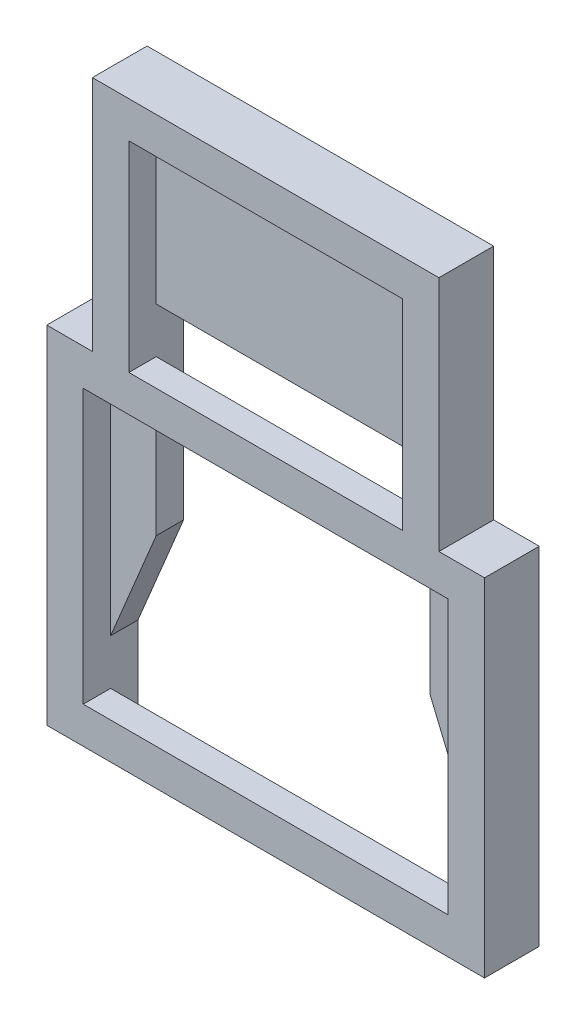
ISO-10303-21;
HEADER;
FILE_DESCRIPTION(('STEP AP214'),'2;1');
FILE_NAME('part.step','',(''),(''),'','','');
FILE_SCHEMA(('AUTOMOTIVE_DESIGN { 1 0 10303 214 1 1 1 1 }'));
ENDSEC;
DATA;
#1=APPLICATION_CONTEXT('core data for automotive mechanical design processes');
#2=APPLICATION_PROTOCOL_DEFINITION('international standard','automotive_design',2000,#1);
#3=PRODUCT_CONTEXT('',#1,'mechanical');
#4=PRODUCT('Part','Part','',(#3));
#5=PRODUCT_RELATED_PRODUCT_CATEGORY('part','',(#4));
#6=PRODUCT_DEFINITION_FORMATION('','',#4);
#7=PRODUCT_DEFINITION_CONTEXT('part definition',#1,'design');
#8=PRODUCT_DEFINITION('design','',#6,#7);
#9=PRODUCT_DEFINITION_SHAPE('','',#8);
#10=(LENGTH_UNIT() NAMED_UNIT(*) SI_UNIT(.MILLI.,.METRE.));
#11=(NAMED_UNIT(*) PLANE_ANGLE_UNIT() SI_UNIT($,.RADIAN.));
#12=(NAMED_UNIT(*) SI_UNIT($,.STERADIAN.) SOLID_ANGLE_UNIT());
#13=UNCERTAINTY_MEASURE_WITH_UNIT(LENGTH_MEASURE(1.E-05),#10,'distance_accuracy_value','');
#14=(GEOMETRIC_REPRESENTATION_CONTEXT(3) GLOBAL_UNCERTAINTY_ASSIGNED_CONTEXT((#13)) GLOBAL_UNIT_ASSIGNED_CONTEXT((#10,
#11,#12)) REPRESENTATION_CONTEXT('',''));
#15=CARTESIAN_POINT('',(0.,0.,0.));
#16=DIRECTION('',(0.,0.,1.));
#17=DIRECTION('',(1.,0.,0.));
#18=AXIS2_PLACEMENT_3D('',#15,#16,#17);
#19=CARTESIAN_POINT('',(0.,0.,0.));
#20=DIRECTION('',(0.,0.,1.));
#21=DIRECTION('',(1.,0.,0.));
#22=AXIS2_PLACEMENT_3D('',#19,#20,#21);
#23=PLANE('',#22);
#24=DIRECTION('',(0.,-1.,0.));
#25=VECTOR('',#24,1.);
#26=CARTESIAN_POINT('',(-10.,0.,0.));
#27=LINE('',#26,#25);
#28=CARTESIAN_POINT('',(-10.,0.,0.));
#29=VERTEX_POINT('',#28);
#30=CARTESIAN_POINT('',(-10.,-2.,0.));
#31=VERTEX_POINT('',#30);
#32=EDGE_CURVE('E11',#29,#31,#27,.T.);
#33=ORIENTED_EDGE('',*,*,#32,.F.);
#34=DIRECTION('',(1.,0.,0.));
#35=VECTOR('',#34,1.);
#36=CARTESIAN_POINT('',(0.,0.,0.));
#37=LINE('',#36,#35);
#38=CARTESIAN_POINT('',(10.,0.,0.));
#39=VERTEX_POINT('',#38);
#40=EDGE_CURVE('E399',#29,#39,#37,.T.);
#41=ORIENTED_EDGE('',*,*,#40,.T.);
#42=DIRECTION('',(0.,1.,0.));
#43=VECTOR('',#42,1.);
#44=CARTESIAN_POINT('',(10.,0.,0.));
#45=LINE('',#44,#43);
#46=CARTESIAN_POINT('',(10.,-2.,0.));
#47=VERTEX_POINT('',#46);
#48=EDGE_CURVE('E238',#47,#39,#45,.T.);
#49=ORIENTED_EDGE('',*,*,#48,.F.);
#50=DIRECTION('',(1.,0.,0.));
#51=VECTOR('',#50,1.);
#52=CARTESIAN_POINT('',(0.,-2.,0.));
#53=LINE('',#52,#51);
#54=EDGE_CURVE('E411',#31,#47,#53,.T.);
#55=ORIENTED_EDGE('',*,*,#54,.F.);
#56=EDGE_LOOP('',(#33,#41,#49,#55));
#57=FACE_BOUND('',#56,.T.);
#58=ADVANCED_FACE('F41',(#57),#23,.F.);
#59=DIRECTION('',(0.,-1.,0.));
#60=VECTOR('',#59,1.);
#61=CARTESIAN_POINT('',(-7.5,0.,0.));
#62=LINE('',#61,#60);
#63=CARTESIAN_POINT('',(-7.5,17.,0.));
#64=VERTEX_POINT('',#63);
#65=CARTESIAN_POINT('',(-7.5,15.,0.));
#66=VERTEX_POINT('',#65);
#67=EDGE_CURVE('E51',#64,#66,#62,.T.);
#68=ORIENTED_EDGE('',*,*,#67,.F.);
#69=DIRECTION('',(-1.,0.,0.));
#70=VECTOR('',#69,1.);
#71=CARTESIAN_POINT('',(0.,17.,0.));
#72=LINE('',#71,#70);
#73=CARTESIAN_POINT('',(7.5,17.,0.));
#74=VERTEX_POINT('',#73);
#75=EDGE_CURVE('E416',#74,#64,#72,.T.);
#76=ORIENTED_EDGE('',*,*,#75,.F.);
#77=DIRECTION('',(0.,-1.,0.));
#78=VECTOR('',#77,1.);
#79=CARTESIAN_POINT('',(7.5,0.,0.));
#80=LINE('',#79,#78);
#81=CARTESIAN_POINT('',(7.5,15.,0.));
#82=VERTEX_POINT('',#81);
#83=EDGE_CURVE('E308',#74,#82,#80,.T.);
#84=ORIENTED_EDGE('',*,*,#83,.T.);
#85=DIRECTION('',(-1.,0.,0.));
#86=VECTOR('',#85,1.);
#87=CARTESIAN_POINT('',(0.,15.,0.));
#88=LINE('',#87,#86);
#89=EDGE_CURVE('E412',#82,#66,#88,.T.);
#90=ORIENTED_EDGE('',*,*,#89,.T.);
#91=EDGE_LOOP('',(#68,#76,#84,#90));
#92=FACE_BOUND('',#91,.T.);
#93=ADVANCED_FACE('F534',(#92),#23,.F.);
#94=CARTESIAN_POINT('',(0.,17.,1.5));
#95=DIRECTION('',(0.,-1.,0.));
#96=DIRECTION('',(1.,0.,0.));
#97=AXIS2_PLACEMENT_3D('',#94,#95,#96);
#98=PLANE('',#97);
#99=ORIENTED_EDGE('',*,*,#75,.T.);
#100=DIRECTION('',(0.,0.,-1.));
#101=VECTOR('',#100,1.);
#102=CARTESIAN_POINT('',(-7.5,17.,1.5));
#103=LINE('',#102,#101);
#104=CARTESIAN_POINT('',(-7.5,17.,1.5));
#105=VERTEX_POINT('',#104);
#106=EDGE_CURVE('E437',#105,#64,#103,.T.);
#107=ORIENTED_EDGE('',*,*,#106,.F.);
#108=DIRECTION('',(-1.,0.,0.));
#109=VECTOR('',#108,1.);
#110=CARTESIAN_POINT('',(0.,17.,1.5));
#111=LINE('',#110,#109);
#112=CARTESIAN_POINT('',(7.5,17.,1.5));
#113=VERTEX_POINT('',#112);
#114=EDGE_CURVE('E382',#113,#105,#111,.T.);
#115=ORIENTED_EDGE('',*,*,#114,.F.);
#116=DIRECTION('',(0.,0.,-1.));
#117=VECTOR('',#116,1.);
#118=CARTESIAN_POINT('',(7.5,17.,1.5));
#119=LINE('',#118,#117);
#120=EDGE_CURVE('E427',#113,#74,#119,.T.);
#121=ORIENTED_EDGE('',*,*,#120,.T.);
#122=EDGE_LOOP('',(#99,#107,#115,#121));
#123=FACE_BOUND('',#122,.T.);
#124=ADVANCED_FACE('F539',(#123),#98,.F.);
#125=CARTESIAN_POINT('',(-7.5,0.,1.5));
#126=DIRECTION('',(1.,0.,0.));
#127=DIRECTION('',(0.,1.,0.));
#128=AXIS2_PLACEMENT_3D('',#125,#126,#127);
#129=PLANE('',#128);
#130=DIRECTION('',(0.,-1.,0.));
#131=VECTOR('',#130,1.);
#132=CARTESIAN_POINT('',(-7.5,0.,0.));
#133=LINE('',#132,#131);
#134=CARTESIAN_POINT('',(-7.5,28.,0.));
#135=VERTEX_POINT('',#134);
#136=CARTESIAN_POINT('',(-7.5,19.5,0.));
#137=VERTEX_POINT('',#136);
#138=EDGE_CURVE('E59',#135,#137,#133,.T.);
#139=ORIENTED_EDGE('',*,*,#138,.F.);
#140=DIRECTION('',(0.,0.,-1.));
#141=VECTOR('',#140,1.);
#142=CARTESIAN_POINT('',(-7.5,28.,1.5));
#143=LINE('',#142,#141);
#144=CARTESIAN_POINT('',(-7.5,28.,1.5));
#145=VERTEX_POINT('',#144);
#146=EDGE_CURVE('E434',#145,#135,#143,.T.);
#147=ORIENTED_EDGE('',*,*,#146,.F.);
#148=DIRECTION('',(0.,-1.,0.));
#149=VECTOR('',#148,1.);
#150=CARTESIAN_POINT('',(-7.5,0.,1.5));
#151=LINE('',#150,#149);
#152=EDGE_CURVE('E385',#145,#105,#151,.T.);
#153=ORIENTED_EDGE('',*,*,#152,.T.);
#154=ORIENTED_EDGE('',*,*,#106,.T.);
#155=ORIENTED_EDGE('',*,*,#67,.T.);
#156=CARTESIAN_POINT('',(-7.5,8.5,0.));
#157=VERTEX_POINT('',#156);
#158=EDGE_CURVE('E298',#66,#157,#62,.T.);
#159=ORIENTED_EDGE('',*,*,#158,.T.);
#160=DIRECTION('',(0.,0.,1.));
#161=VECTOR('',#160,1.);
#162=CARTESIAN_POINT('',(-7.5,8.5,-1.5));
#163=LINE('',#162,#161);
#164=CARTESIAN_POINT('',(-7.5,8.5,-1.5));
#165=VERTEX_POINT('',#164);
#166=EDGE_CURVE('E226',#165,#157,#163,.T.);
#167=ORIENTED_EDGE('',*,*,#166,.F.);
#168=DIRECTION('',(0.,-1.,0.));
#169=VECTOR('',#168,1.);
#170=CARTESIAN_POINT('',(-7.5,0.,-1.5));
#171=LINE('',#170,#169);
#172=CARTESIAN_POINT('',(-7.5,19.5,-1.5));
#173=VERTEX_POINT('',#172);
#174=EDGE_CURVE('E242',#173,#165,#171,.T.);
#175=ORIENTED_EDGE('',*,*,#174,.F.);
#176=DIRECTION('',(0.,0.,1.));
#177=VECTOR('',#176,1.);
#178=CARTESIAN_POINT('',(-7.5,19.5,-1.5));
#179=LINE('',#178,#177);
#180=EDGE_CURVE('E333',#173,#137,#179,.T.);
#181=ORIENTED_EDGE('',*,*,#180,.T.);
#182=EDGE_LOOP('',(#139,#147,#153,#154,#155,#159,#167,#175,#181));
#183=FACE_BOUND('',#182,.T.);
#184=ADVANCED_FACE('F549',(#183),#129,.T.);
#185=CARTESIAN_POINT('',(0.,28.,1.5));
#186=DIRECTION('',(0.,1.,0.));
#187=DIRECTION('',(-1.,0.,0.));
#188=AXIS2_PLACEMENT_3D('',#185,#186,#187);
#189=PLANE('',#188);
#190=DIRECTION('',(1.,0.,0.));
#191=VECTOR('',#190,1.);
#192=CARTESIAN_POINT('',(0.,28.,0.));
#193=LINE('',#192,#191);
#194=CARTESIAN_POINT('',(7.5,28.,0.));
#195=VERTEX_POINT('',#194);
#196=EDGE_CURVE('E422',#135,#195,#193,.T.);
#197=ORIENTED_EDGE('',*,*,#196,.T.);
#198=DIRECTION('',(0.,0.,-1.));
#199=VECTOR('',#198,1.);
#200=CARTESIAN_POINT('',(7.5,28.,1.5));
#201=LINE('',#200,#199);
#202=CARTESIAN_POINT('',(7.5,28.,1.5));
#203=VERTEX_POINT('',#202);
#204=EDGE_CURVE('E430',#203,#195,#201,.T.);
#205=ORIENTED_EDGE('',*,*,#204,.F.);
#206=DIRECTION('',(1.,0.,0.));
#207=VECTOR('',#206,1.);
#208=CARTESIAN_POINT('',(0.,28.,1.5));
#209=LINE('',#208,#207);
#210=EDGE_CURVE('E389',#145,#203,#209,.T.);
#211=ORIENTED_EDGE('',*,*,#210,.F.);
#212=ORIENTED_EDGE('',*,*,#146,.T.);
#213=EDGE_LOOP('',(#197,#205,#211,#212));
#214=FACE_BOUND('',#213,.T.);
#215=ADVANCED_FACE('F546',(#214),#189,.F.);
#216=CARTESIAN_POINT('',(0.,-2.,1.5));
#217=DIRECTION('',(0.,1.,0.));
#218=DIRECTION('',(0.,0.,1.));
#219=AXIS2_PLACEMENT_3D('',#216,#217,#218);
#220=PLANE('',#219);
#221=DIRECTION('',(0.,0.,-1.));
#222=VECTOR('',#221,1.);
#223=CARTESIAN_POINT('',(-12.,-2.,1.5));
#224=LINE('',#223,#222);
#225=CARTESIAN_POINT('',(-12.,-2.,1.5));
#226=VERTEX_POINT('',#225);
#227=CARTESIAN_POINT('',(-12.,-2.,-1.5));
#228=VERTEX_POINT('',#227);
#229=EDGE_CURVE('E441',#226,#228,#224,.T.);
#230=ORIENTED_EDGE('',*,*,#229,.T.);
#231=DIRECTION('',(1.,0.,0.));
#232=VECTOR('',#231,1.);
#233=CARTESIAN_POINT('',(0.,-2.,-1.5));
#234=LINE('',#233,#232);
#235=CARTESIAN_POINT('',(-10.,-2.,-1.5));
#236=VERTEX_POINT('',#235);
#237=EDGE_CURVE('E227',#228,#236,#234,.T.);
#238=ORIENTED_EDGE('',*,*,#237,.T.);
#239=DIRECTION('',(0.,0.,1.));
#240=VECTOR('',#239,1.);
#241=CARTESIAN_POINT('',(-10.,-2.,-1.5));
#242=LINE('',#241,#240);
#243=EDGE_CURVE('E233',#236,#31,#242,.T.);
#244=ORIENTED_EDGE('',*,*,#243,.T.);
#245=ORIENTED_EDGE('',*,*,#54,.T.);
#246=DIRECTION('',(0.,0.,1.));
#247=VECTOR('',#246,1.);
#248=CARTESIAN_POINT('',(10.,-2.,-1.5));
#249=LINE('',#248,#247);
#250=CARTESIAN_POINT('',(10.,-2.,-1.5));
#251=VERTEX_POINT('',#250);
#252=EDGE_CURVE('E318',#251,#47,#249,.T.);
#253=ORIENTED_EDGE('',*,*,#252,.F.);
#254=DIRECTION('',(1.,0.,0.));
#255=VECTOR('',#254,1.);
#256=CARTESIAN_POINT('',(0.,-2.,-1.5));
#257=LINE('',#256,#255);
#258=CARTESIAN_POINT('',(12.,-2.,-1.5));
#259=VERTEX_POINT('',#258);
#260=EDGE_CURVE('E262',#251,#259,#257,.T.);
#261=ORIENTED_EDGE('',*,*,#260,.T.);
#262=DIRECTION('',(0.,0.,-1.));
#263=VECTOR('',#262,1.);
#264=CARTESIAN_POINT('',(12.,-2.,1.5));
#265=LINE('',#264,#263);
#266=CARTESIAN_POINT('',(12.,-2.,1.5));
#267=VERTEX_POINT('',#266);
#268=EDGE_CURVE('E431',#267,#259,#265,.T.);
#269=ORIENTED_EDGE('',*,*,#268,.F.);
#270=DIRECTION('',(1.,0.,0.));
#271=VECTOR('',#270,1.);
#272=CARTESIAN_POINT('',(0.,-2.,1.5));
#273=LINE('',#272,#271);
#274=EDGE_CURVE('E355',#226,#267,#273,.T.);
#275=ORIENTED_EDGE('',*,*,#274,.F.);
#276=EDGE_LOOP('',(#230,#238,#244,#245,#253,#261,#269,#275));
#277=FACE_BOUND('',#276,.T.);
#278=ADVANCED_FACE('F483',(#277),#220,.F.);
#279=CARTESIAN_POINT('',(12.,0.,1.5));
#280=DIRECTION('',(-1.,0.,0.));
#281=DIRECTION('',(0.,0.,1.));
#282=AXIS2_PLACEMENT_3D('',#279,#280,#281);
#283=PLANE('',#282);
#284=ORIENTED_EDGE('',*,*,#268,.T.);
#285=DIRECTION('',(0.,1.,0.));
#286=VECTOR('',#285,1.);
#287=CARTESIAN_POINT('',(12.,0.,-1.5));
#288=LINE('',#287,#286);
#289=CARTESIAN_POINT('',(12.,17.,-1.5));
#290=VERTEX_POINT('',#289);
#291=EDGE_CURVE('E266',#259,#290,#288,.T.);
#292=ORIENTED_EDGE('',*,*,#291,.T.);
#293=DIRECTION('',(0.,0.,-1.));
#294=VECTOR('',#293,1.);
#295=CARTESIAN_POINT('',(12.,17.,1.5));
#296=LINE('',#295,#294);
#297=CARTESIAN_POINT('',(12.,17.,1.5));
#298=VERTEX_POINT('',#297);
#299=EDGE_CURVE('E459',#298,#290,#296,.T.);
#300=ORIENTED_EDGE('',*,*,#299,.F.);
#301=DIRECTION('',(0.,1.,0.));
#302=VECTOR('',#301,1.);
#303=CARTESIAN_POINT('',(12.,0.,1.5));
#304=LINE('',#303,#302);
#305=EDGE_CURVE('E359',#267,#298,#304,.T.);
#306=ORIENTED_EDGE('',*,*,#305,.F.);
#307=EDGE_LOOP('',(#284,#292,#300,#306));
#308=FACE_BOUND('',#307,.T.);
#309=ADVANCED_FACE('F515',(#308),#283,.F.);
#310=CARTESIAN_POINT('',(0.,17.,1.5));
#311=DIRECTION('',(0.,-1.,0.));
#312=DIRECTION('',(0.,0.,-1.));
#313=AXIS2_PLACEMENT_3D('',#310,#311,#312);
#314=PLANE('',#313);
#315=ORIENTED_EDGE('',*,*,#299,.T.);
#316=DIRECTION('',(-1.,0.,0.));
#317=VECTOR('',#316,1.);
#318=CARTESIAN_POINT('',(0.,17.,-1.5));
#319=LINE('',#318,#317);
#320=CARTESIAN_POINT('',(9.5,17.,-1.5));
#321=VERTEX_POINT('',#320);
#322=EDGE_CURVE('E270',#290,#321,#319,.T.);
#323=ORIENTED_EDGE('',*,*,#322,.T.);
#324=DIRECTION('',(0.,0.,-1.));
#325=VECTOR('',#324,1.);
#326=CARTESIAN_POINT('',(9.5,17.,1.5));
#327=LINE('',#326,#325);
#328=CARTESIAN_POINT('',(9.5,17.,1.5));
#329=VERTEX_POINT('',#328);
#330=EDGE_CURVE('E456',#329,#321,#327,.T.);
#331=ORIENTED_EDGE('',*,*,#330,.F.);
#332=DIRECTION('',(-1.,0.,0.));
#333=VECTOR('',#332,1.);
#334=CARTESIAN_POINT('',(0.,17.,1.5));
#335=LINE('',#334,#333);
#336=EDGE_CURVE('E362',#298,#329,#335,.T.);
#337=ORIENTED_EDGE('',*,*,#336,.F.);
#338=EDGE_LOOP('',(#315,#323,#331,#337));
#339=FACE_BOUND('',#338,.T.);
#340=ADVANCED_FACE('F511',(#339),#314,.F.);
#341=CARTESIAN_POINT('',(9.5,0.,1.5));
#342=DIRECTION('',(1.,0.,0.));
#343=DIRECTION('',(0.,1.,0.));
#344=AXIS2_PLACEMENT_3D('',#341,#342,#343);
#345=PLANE('',#344);
#346=ORIENTED_EDGE('',*,*,#330,.T.);
#347=DIRECTION('',(0.,-1.,0.));
#348=VECTOR('',#347,1.);
#349=CARTESIAN_POINT('',(9.5,0.,-1.5));
#350=LINE('',#349,#348);
#351=CARTESIAN_POINT('',(9.5,30.,-1.5));
#352=VERTEX_POINT('',#351);
#353=EDGE_CURVE('E274',#352,#321,#350,.T.);
#354=ORIENTED_EDGE('',*,*,#353,.F.);
#355=DIRECTION('',(0.,0.,-1.));
#356=VECTOR('',#355,1.);
#357=CARTESIAN_POINT('',(9.5,30.,1.5));
#358=LINE('',#357,#356);
#359=CARTESIAN_POINT('',(9.5,30.,1.5));
#360=VERTEX_POINT('',#359);
#361=EDGE_CURVE('E453',#360,#352,#358,.T.);
#362=ORIENTED_EDGE('',*,*,#361,.F.);
#363=DIRECTION('',(0.,-1.,0.));
#364=VECTOR('',#363,1.);
#365=CARTESIAN_POINT('',(9.5,0.,1.5));
#366=LINE('',#365,#364);
#367=EDGE_CURVE('E365',#360,#329,#366,.T.);
#368=ORIENTED_EDGE('',*,*,#367,.T.);
#369=EDGE_LOOP('',(#346,#354,#362,#368));
#370=FACE_BOUND('',#369,.T.);
#371=ADVANCED_FACE('F506',(#370),#345,.T.);
#372=CARTESIAN_POINT('',(0.,30.,1.5));
#373=DIRECTION('',(0.,1.,0.));
#374=DIRECTION('',(0.,0.,1.));
#375=AXIS2_PLACEMENT_3D('',#372,#373,#374);
#376=PLANE('',#375);
#377=ORIENTED_EDGE('',*,*,#361,.T.);
#378=DIRECTION('',(1.,0.,0.));
#379=VECTOR('',#378,1.);
#380=CARTESIAN_POINT('',(0.,30.,-1.5));
#381=LINE('',#380,#379);
#382=CARTESIAN_POINT('',(-9.5,30.,-1.5));
#383=VERTEX_POINT('',#382);
#384=EDGE_CURVE('E278',#383,#352,#381,.T.);
#385=ORIENTED_EDGE('',*,*,#384,.F.);
#386=DIRECTION('',(0.,0.,-1.));
#387=VECTOR('',#386,1.);
#388=CARTESIAN_POINT('',(-9.5,30.,1.5));
#389=LINE('',#388,#387);
#390=CARTESIAN_POINT('',(-9.5,30.,1.5));
#391=VERTEX_POINT('',#390);
#392=EDGE_CURVE('E450',#391,#383,#389,.T.);
#393=ORIENTED_EDGE('',*,*,#392,.F.);
#394=DIRECTION('',(1.,0.,0.));
#395=VECTOR('',#394,1.);
#396=CARTESIAN_POINT('',(0.,30.,1.5));
#397=LINE('',#396,#395);
#398=EDGE_CURVE('E369',#391,#360,#397,.T.);
#399=ORIENTED_EDGE('',*,*,#398,.T.);
#400=EDGE_LOOP('',(#377,#385,#393,#399));
#401=FACE_BOUND('',#400,.T.);
#402=ADVANCED_FACE('F740',(#401),#376,.T.);
#403=CARTESIAN_POINT('',(-9.5,0.,1.5));
#404=DIRECTION('',(1.,0.,0.));
#405=DIRECTION('',(0.,0.,-1.));
#406=AXIS2_PLACEMENT_3D('',#403,#404,#405);
#407=PLANE('',#406);
#408=ORIENTED_EDGE('',*,*,#392,.T.);
#409=DIRECTION('',(0.,-1.,0.));
#410=VECTOR('',#409,1.);
#411=CARTESIAN_POINT('',(-9.5,0.,-1.5));
#412=LINE('',#411,#410);
#413=CARTESIAN_POINT('',(-9.5,17.,-1.5));
#414=VERTEX_POINT('',#413);
#415=EDGE_CURVE('E282',#383,#414,#412,.T.);
#416=ORIENTED_EDGE('',*,*,#415,.T.);
#417=DIRECTION('',(0.,0.,-1.));
#418=VECTOR('',#417,1.);
#419=CARTESIAN_POINT('',(-9.5,17.,1.5));
#420=LINE('',#419,#418);
#421=CARTESIAN_POINT('',(-9.5,17.,1.5));
#422=VERTEX_POINT('',#421);
#423=EDGE_CURVE('E447',#422,#414,#420,.T.);
#424=ORIENTED_EDGE('',*,*,#423,.F.);
#425=DIRECTION('',(0.,-1.,0.));
#426=VECTOR('',#425,1.);
#427=CARTESIAN_POINT('',(-9.5,0.,1.5));
#428=LINE('',#427,#426);
#429=EDGE_CURVE('E373',#391,#422,#428,.T.);
#430=ORIENTED_EDGE('',*,*,#429,.F.);
#431=EDGE_LOOP('',(#408,#416,#424,#430));
#432=FACE_BOUND('',#431,.T.);
#433=ADVANCED_FACE('F499',(#432),#407,.F.);
#434=CARTESIAN_POINT('',(0.,17.,1.5));
#435=DIRECTION('',(0.,-1.,0.));
#436=DIRECTION('',(1.,0.,0.));
#437=AXIS2_PLACEMENT_3D('',#434,#435,#436);
#438=PLANE('',#437);
#439=ORIENTED_EDGE('',*,*,#423,.T.);
#440=DIRECTION('',(-1.,0.,0.));
#441=VECTOR('',#440,1.);
#442=CARTESIAN_POINT('',(0.,17.,-1.5));
#443=LINE('',#442,#441);
#444=CARTESIAN_POINT('',(-12.,17.,-1.5));
#445=VERTEX_POINT('',#444);
#446=EDGE_CURVE('E286',#414,#445,#443,.T.);
#447=ORIENTED_EDGE('',*,*,#446,.T.);
#448=DIRECTION('',(0.,0.,-1.));
#449=VECTOR('',#448,1.);
#450=CARTESIAN_POINT('',(-12.,17.,1.5));
#451=LINE('',#450,#449);
#452=CARTESIAN_POINT('',(-12.,17.,1.5));
#453=VERTEX_POINT('',#452);
#454=EDGE_CURVE('E444',#453,#445,#451,.T.);
#455=ORIENTED_EDGE('',*,*,#454,.F.);
#456=DIRECTION('',(-1.,0.,0.));
#457=VECTOR('',#456,1.);
#458=CARTESIAN_POINT('',(0.,17.,1.5));
#459=LINE('',#458,#457);
#460=EDGE_CURVE('E376',#422,#453,#459,.T.);
#461=ORIENTED_EDGE('',*,*,#460,.F.);
#462=EDGE_LOOP('',(#439,#447,#455,#461));
#463=FACE_BOUND('',#462,.T.);
#464=ADVANCED_FACE('F493',(#463),#438,.F.);
#465=CARTESIAN_POINT('',(10.,0.,1.5));
#466=DIRECTION('',(-1.,0.,0.));
#467=DIRECTION('',(0.,-1.,0.));
#468=AXIS2_PLACEMENT_3D('',#465,#466,#467);
#469=PLANE('',#468);
#470=DIRECTION('',(0.,1.,0.));
#471=VECTOR('',#470,1.);
#472=CARTESIAN_POINT('',(10.,0.,0.));
#473=LINE('',#472,#471);
#474=CARTESIAN_POINT('',(10.,2.5,0.));
#475=VERTEX_POINT('',#474);
#476=CARTESIAN_POINT('',(10.,15.,0.));
#477=VERTEX_POINT('',#476);
#478=EDGE_CURVE('E317',#475,#477,#473,.T.);
#479=ORIENTED_EDGE('',*,*,#478,.F.);
#480=DIRECTION('',(0.,0.,1.));
#481=VECTOR('',#480,1.);
#482=CARTESIAN_POINT('',(10.,2.5,-1.5));
#483=LINE('',#482,#481);
#484=CARTESIAN_POINT('',(10.,2.5,-1.5));
#485=VERTEX_POINT('',#484);
#486=EDGE_CURVE('E322',#485,#475,#483,.T.);
#487=ORIENTED_EDGE('',*,*,#486,.F.);
#488=DIRECTION('',(0.,1.,0.));
#489=VECTOR('',#488,1.);
#490=CARTESIAN_POINT('',(10.,0.,-1.5));
#491=LINE('',#490,#489);
#492=EDGE_CURVE('E259',#251,#485,#491,.T.);
#493=ORIENTED_EDGE('',*,*,#492,.F.);
#494=ORIENTED_EDGE('',*,*,#252,.T.);
#495=ORIENTED_EDGE('',*,*,#48,.T.);
#496=DIRECTION('',(0.,0.,-1.));
#497=VECTOR('',#496,1.);
#498=CARTESIAN_POINT('',(10.,0.,1.5));
#499=LINE('',#498,#497);
#500=CARTESIAN_POINT('',(10.,0.,1.5));
#501=VERTEX_POINT('',#500);
#502=EDGE_CURVE('E45',#501,#39,#499,.T.);
#503=ORIENTED_EDGE('',*,*,#502,.F.);
#504=DIRECTION('',(0.,1.,0.));
#505=VECTOR('',#504,1.);
#506=CARTESIAN_POINT('',(10.,0.,1.5));
#507=LINE('',#506,#505);
#508=CARTESIAN_POINT('',(10.,15.,1.5));
#509=VERTEX_POINT('',#508);
#510=EDGE_CURVE('E339',#501,#509,#507,.T.);
#511=ORIENTED_EDGE('',*,*,#510,.T.);
#512=DIRECTION('',(0.,0.,-1.));
#513=VECTOR('',#512,1.);
#514=CARTESIAN_POINT('',(10.,15.,1.5));
#515=LINE('',#514,#513);
#516=EDGE_CURVE('E395',#509,#477,#515,.T.);
#517=ORIENTED_EDGE('',*,*,#516,.T.);
#518=EDGE_LOOP('',(#479,#487,#493,#494,#495,#503,#511,#517));
#519=FACE_BOUND('',#518,.T.);
#520=ADVANCED_FACE('F43',(#519),#469,.T.);
#521=CARTESIAN_POINT('',(0.,0.,1.5));
#522=DIRECTION('',(0.,1.,0.));
#523=DIRECTION('',(0.,0.,1.));
#524=AXIS2_PLACEMENT_3D('',#521,#522,#523);
#525=PLANE('',#524);
#526=ORIENTED_EDGE('',*,*,#40,.F.);
#527=DIRECTION('',(0.,0.,-1.));
#528=VECTOR('',#527,1.);
#529=CARTESIAN_POINT('',(-10.,0.,1.5));
#530=LINE('',#529,#528);
#531=CARTESIAN_POINT('',(-10.,0.,1.5));
#532=VERTEX_POINT('',#531);
#533=EDGE_CURVE('E468',#532,#29,#530,.T.);
#534=ORIENTED_EDGE('',*,*,#533,.F.);
#535=DIRECTION('',(1.,0.,0.));
#536=VECTOR('',#535,1.);
#537=CARTESIAN_POINT('',(0.,0.,1.5));
#538=LINE('',#537,#536);
#539=EDGE_CURVE('E343',#532,#501,#538,.T.);
#540=ORIENTED_EDGE('',*,*,#539,.T.);
#541=ORIENTED_EDGE('',*,*,#502,.T.);
#542=EDGE_LOOP('',(#526,#534,#540,#541));
#543=FACE_BOUND('',#542,.T.);
#544=ADVANCED_FACE('F474',(#543),#525,.T.);
#545=CARTESIAN_POINT('',(-10.,0.,1.5));
#546=DIRECTION('',(1.,0.,0.));
#547=DIRECTION('',(0.,0.,-1.));
#548=AXIS2_PLACEMENT_3D('',#545,#546,#547);
#549=PLANE('',#548);
#550=DIRECTION('',(0.,-1.,0.));
#551=VECTOR('',#550,1.);
#552=CARTESIAN_POINT('',(-10.,0.,0.));
#553=LINE('',#552,#551);
#554=CARTESIAN_POINT('',(-10.,15.,0.));
#555=VERTEX_POINT('',#554);
#556=CARTESIAN_POINT('',(-10.,2.5,0.));
#557=VERTEX_POINT('',#556);
#558=EDGE_CURVE('E403',#555,#557,#553,.T.);
#559=ORIENTED_EDGE('',*,*,#558,.F.);
#560=DIRECTION('',(0.,0.,-1.));
#561=VECTOR('',#560,1.);
#562=CARTESIAN_POINT('',(-10.,15.,1.5));
#563=LINE('',#562,#561);
#564=CARTESIAN_POINT('',(-10.,15.,1.5));
#565=VERTEX_POINT('',#564);
#566=EDGE_CURVE('E466',#565,#555,#563,.T.);
#567=ORIENTED_EDGE('',*,*,#566,.F.);
#568=DIRECTION('',(0.,-1.,0.));
#569=VECTOR('',#568,1.);
#570=CARTESIAN_POINT('',(-10.,0.,1.5));
#571=LINE('',#570,#569);
#572=EDGE_CURVE('E347',#565,#532,#571,.T.);
#573=ORIENTED_EDGE('',*,*,#572,.T.);
#574=ORIENTED_EDGE('',*,*,#533,.T.);
#575=ORIENTED_EDGE('',*,*,#32,.T.);
#576=ORIENTED_EDGE('',*,*,#243,.F.);
#577=DIRECTION('',(0.,-1.,0.));
#578=VECTOR('',#577,1.);
#579=CARTESIAN_POINT('',(-10.,0.,-1.5));
#580=LINE('',#579,#578);
#581=CARTESIAN_POINT('',(-10.,2.5,-1.5));
#582=VERTEX_POINT('',#581);
#583=EDGE_CURVE('E230',#582,#236,#580,.T.);
#584=ORIENTED_EDGE('',*,*,#583,.F.);
#585=DIRECTION('',(0.,0.,1.));
#586=VECTOR('',#585,1.);
#587=CARTESIAN_POINT('',(-10.,2.5,-1.5));
#588=LINE('',#587,#586);
#589=EDGE_CURVE('E215',#582,#557,#588,.T.);
#590=ORIENTED_EDGE('',*,*,#589,.T.);
#591=EDGE_LOOP('',(#559,#567,#573,#574,#575,#576,#584,#590));
#592=FACE_BOUND('',#591,.T.);
#593=ADVANCED_FACE('F231',(#592),#549,.T.);
#594=CARTESIAN_POINT('',(-12.,0.,1.5));
#595=DIRECTION('',(1.,0.,0.));
#596=DIRECTION('',(0.,0.,-1.));
#597=AXIS2_PLACEMENT_3D('',#594,#595,#596);
#598=PLANE('',#597);
#599=ORIENTED_EDGE('',*,*,#454,.T.);
#600=DIRECTION('',(0.,-1.,0.));
#601=VECTOR('',#600,1.);
#602=CARTESIAN_POINT('',(-12.,0.,-1.5));
#603=LINE('',#602,#601);
#604=EDGE_CURVE('E290',#445,#228,#603,.T.);
#605=ORIENTED_EDGE('',*,*,#604,.T.);
#606=ORIENTED_EDGE('',*,*,#229,.F.);
#607=DIRECTION('',(0.,-1.,0.));
#608=VECTOR('',#607,1.);
#609=CARTESIAN_POINT('',(-12.,0.,1.5));
#610=LINE('',#609,#608);
#611=EDGE_CURVE('E379',#453,#226,#610,.T.);
#612=ORIENTED_EDGE('',*,*,#611,.F.);
#613=EDGE_LOOP('',(#599,#605,#606,#612));
#614=FACE_BOUND('',#613,.T.);
#615=ADVANCED_FACE('F519',(#614),#598,.F.);
#616=CARTESIAN_POINT('',(0.,15.,1.5));
#617=DIRECTION('',(0.,-1.,0.));
#618=DIRECTION('',(1.,0.,0.));
#619=AXIS2_PLACEMENT_3D('',#616,#617,#618);
#620=PLANE('',#619);
#621=EDGE_CURVE('E407',#477,#82,#88,.T.);
#622=ORIENTED_EDGE('',*,*,#621,.F.);
#623=ORIENTED_EDGE('',*,*,#516,.F.);
#624=DIRECTION('',(-1.,0.,0.));
#625=VECTOR('',#624,1.);
#626=CARTESIAN_POINT('',(0.,15.,1.5));
#627=LINE('',#626,#625);
#628=EDGE_CURVE('E351',#509,#565,#627,.T.);
#629=ORIENTED_EDGE('',*,*,#628,.T.);
#630=ORIENTED_EDGE('',*,*,#566,.T.);
#631=EDGE_CURVE('E406',#66,#555,#88,.T.);
#632=ORIENTED_EDGE('',*,*,#631,.F.);
#633=ORIENTED_EDGE('',*,*,#89,.F.);
#634=EDGE_LOOP('',(#622,#623,#629,#630,#632,#633));
#635=FACE_BOUND('',#634,.T.);
#636=ADVANCED_FACE('F521',(#635),#620,.T.);
#637=CARTESIAN_POINT('',(7.5,0.,1.5));
#638=DIRECTION('',(1.,0.,0.));
#639=DIRECTION('',(0.,0.,-1.));
#640=AXIS2_PLACEMENT_3D('',#637,#638,#639);
#641=PLANE('',#640);
#642=DIRECTION('',(0.,-1.,0.));
#643=VECTOR('',#642,1.);
#644=CARTESIAN_POINT('',(7.5,0.,0.));
#645=LINE('',#644,#643);
#646=CARTESIAN_POINT('',(7.5,19.5,0.));
#647=VERTEX_POINT('',#646);
#648=EDGE_CURVE('E67',#195,#647,#645,.T.);
#649=ORIENTED_EDGE('',*,*,#648,.T.);
#650=DIRECTION('',(0.,0.,1.));
#651=VECTOR('',#650,1.);
#652=CARTESIAN_POINT('',(7.5,19.5,-1.5));
#653=LINE('',#652,#651);
#654=CARTESIAN_POINT('',(7.5,19.5,-1.5));
#655=VERTEX_POINT('',#654);
#656=EDGE_CURVE('E330',#655,#647,#653,.T.);
#657=ORIENTED_EDGE('',*,*,#656,.F.);
#658=DIRECTION('',(0.,-1.,0.));
#659=VECTOR('',#658,1.);
#660=CARTESIAN_POINT('',(7.5,0.,-1.5));
#661=LINE('',#660,#659);
#662=CARTESIAN_POINT('',(7.5,8.5,-1.5));
#663=VERTEX_POINT('',#662);
#664=EDGE_CURVE('E252',#655,#663,#661,.T.);
#665=ORIENTED_EDGE('',*,*,#664,.T.);
#666=DIRECTION('',(0.,0.,1.));
#667=VECTOR('',#666,1.);
#668=CARTESIAN_POINT('',(7.5,8.5,-1.5));
#669=LINE('',#668,#667);
#670=CARTESIAN_POINT('',(7.5,8.5,0.));
#671=VERTEX_POINT('',#670);
#672=EDGE_CURVE('E326',#663,#671,#669,.T.);
#673=ORIENTED_EDGE('',*,*,#672,.T.);
#674=EDGE_CURVE('E304',#82,#671,#80,.T.);
#675=ORIENTED_EDGE('',*,*,#674,.F.);
#676=ORIENTED_EDGE('',*,*,#83,.F.);
#677=ORIENTED_EDGE('',*,*,#120,.F.);
#678=DIRECTION('',(0.,-1.,0.));
#679=VECTOR('',#678,1.);
#680=CARTESIAN_POINT('',(7.5,0.,1.5));
#681=LINE('',#680,#679);
#682=EDGE_CURVE('E392',#203,#113,#681,.T.);
#683=ORIENTED_EDGE('',*,*,#682,.F.);
#684=ORIENTED_EDGE('',*,*,#204,.T.);
#685=EDGE_LOOP('',(#649,#657,#665,#673,#675,#676,#677,#683,#684));
#686=FACE_BOUND('',#685,.T.);
#687=ADVANCED_FACE('F527',(#686),#641,.F.);
#688=CARTESIAN_POINT('',(0.,0.,1.5));
#689=DIRECTION('',(0.,0.,1.));
#690=DIRECTION('',(1.,0.,0.));
#691=AXIS2_PLACEMENT_3D('',#688,#689,#690);
#692=PLANE('',#691);
#693=ORIENTED_EDGE('',*,*,#510,.F.);
#694=ORIENTED_EDGE('',*,*,#539,.F.);
#695=ORIENTED_EDGE('',*,*,#572,.F.);
#696=ORIENTED_EDGE('',*,*,#628,.F.);
#697=EDGE_LOOP('',(#693,#694,#695,#696));
#698=FACE_BOUND('',#697,.T.);
#699=ORIENTED_EDGE('',*,*,#274,.T.);
#700=ORIENTED_EDGE('',*,*,#305,.T.);
#701=ORIENTED_EDGE('',*,*,#336,.T.);
#702=ORIENTED_EDGE('',*,*,#367,.F.);
#703=ORIENTED_EDGE('',*,*,#398,.F.);
#704=ORIENTED_EDGE('',*,*,#429,.T.);
#705=ORIENTED_EDGE('',*,*,#460,.T.);
#706=ORIENTED_EDGE('',*,*,#611,.T.);
#707=EDGE_LOOP('',(#699,#700,#701,#702,#703,#704,#705,#706));
#708=FACE_BOUND('',#707,.T.);
#709=ORIENTED_EDGE('',*,*,#114,.T.);
#710=ORIENTED_EDGE('',*,*,#152,.F.);
#711=ORIENTED_EDGE('',*,*,#210,.T.);
#712=ORIENTED_EDGE('',*,*,#682,.T.);
#713=EDGE_LOOP('',(#709,#710,#711,#712));
#714=FACE_BOUND('',#713,.T.);
#715=ADVANCED_FACE('F517',(#698,#708,#714),#692,.T.);
#716=CARTESIAN_POINT('',(0.,0.,0.));
#717=DIRECTION('',(0.,0.,1.));
#718=DIRECTION('',(1.,0.,0.));
#719=AXIS2_PLACEMENT_3D('',#716,#717,#718);
#720=PLANE('',#719);
#721=DIRECTION('',(-0.384615384615385,0.923076923076923,0.));
#722=VECTOR('',#721,1.);
#723=CARTESIAN_POINT('',(9.40828402366864,3.92011834319527,0.));
#724=LINE('',#723,#722);
#725=EDGE_CURVE('E307',#475,#671,#724,.T.);
#726=ORIENTED_EDGE('',*,*,#725,.F.);
#727=ORIENTED_EDGE('',*,*,#478,.T.);
#728=ORIENTED_EDGE('',*,*,#621,.T.);
#729=ORIENTED_EDGE('',*,*,#674,.T.);
#730=EDGE_LOOP('',(#726,#727,#728,#729));
#731=FACE_BOUND('',#730,.T.);
#732=ADVANCED_FACE('F591',(#731),#720,.T.);
#733=ORIENTED_EDGE('',*,*,#648,.F.);
#734=ORIENTED_EDGE('',*,*,#196,.F.);
#735=ORIENTED_EDGE('',*,*,#138,.T.);
#736=DIRECTION('',(-1.,0.,0.));
#737=VECTOR('',#736,1.);
#738=CARTESIAN_POINT('',(0.,19.5,0.));
#739=LINE('',#738,#737);
#740=EDGE_CURVE('E301',#647,#137,#739,.T.);
#741=ORIENTED_EDGE('',*,*,#740,.F.);
#742=EDGE_LOOP('',(#733,#734,#735,#741));
#743=FACE_BOUND('',#742,.T.);
#744=ADVANCED_FACE('F573',(#743),#720,.T.);
#745=CARTESIAN_POINT('',(9.40828402366864,3.92011834319527,-1.5));
#746=DIRECTION('',(0.923076923076923,0.384615384615385,0.));
#747=DIRECTION('',(-0.384615384615385,0.923076923076923,0.));
#748=AXIS2_PLACEMENT_3D('',#745,#746,#747);
#749=PLANE('',#748);
#750=ORIENTED_EDGE('',*,*,#725,.T.);
#751=ORIENTED_EDGE('',*,*,#672,.F.);
#752=DIRECTION('',(-0.384615384615385,0.923076923076923,0.));
#753=VECTOR('',#752,1.);
#754=CARTESIAN_POINT('',(9.40828402366864,3.92011834319527,-1.5));
#755=LINE('',#754,#753);
#756=EDGE_CURVE('E256',#485,#663,#755,.T.);
#757=ORIENTED_EDGE('',*,*,#756,.F.);
#758=ORIENTED_EDGE('',*,*,#486,.T.);
#759=EDGE_LOOP('',(#750,#751,#757,#758));
#760=FACE_BOUND('',#759,.T.);
#761=ADVANCED_FACE('F589',(#760),#749,.F.);
#762=CARTESIAN_POINT('',(0.,19.5,-1.5));
#763=DIRECTION('',(0.,1.,0.));
#764=DIRECTION('',(-1.,0.,0.));
#765=AXIS2_PLACEMENT_3D('',#762,#763,#764);
#766=PLANE('',#765);
#767=ORIENTED_EDGE('',*,*,#740,.T.);
#768=ORIENTED_EDGE('',*,*,#180,.F.);
#769=DIRECTION('',(-1.,0.,0.));
#770=VECTOR('',#769,1.);
#771=CARTESIAN_POINT('',(0.,19.5,-1.5));
#772=LINE('',#771,#770);
#773=EDGE_CURVE('E247',#655,#173,#772,.T.);
#774=ORIENTED_EDGE('',*,*,#773,.F.);
#775=ORIENTED_EDGE('',*,*,#656,.T.);
#776=EDGE_LOOP('',(#767,#768,#774,#775));
#777=FACE_BOUND('',#776,.T.);
#778=ADVANCED_FACE('F576',(#777),#766,.F.);
#779=CARTESIAN_POINT('',(-9.40828402366864,3.92011834319527,-1.5));
#780=DIRECTION('',(0.923076923076923,-0.384615384615385,0.));
#781=DIRECTION('',(0.384615384615385,0.923076923076923,0.));
#782=AXIS2_PLACEMENT_3D('',#779,#780,#781);
#783=PLANE('',#782);
#784=DIRECTION('',(0.384615384615385,0.923076923076923,0.));
#785=VECTOR('',#784,1.);
#786=CARTESIAN_POINT('',(-9.40828402366864,3.92011834319527,0.));
#787=LINE('',#786,#785);
#788=EDGE_CURVE('E222',#557,#157,#787,.T.);
#789=ORIENTED_EDGE('',*,*,#788,.F.);
#790=ORIENTED_EDGE('',*,*,#589,.F.);
#791=DIRECTION('',(0.384615384615385,0.923076923076923,0.));
#792=VECTOR('',#791,1.);
#793=CARTESIAN_POINT('',(-9.40828402366864,3.92011834319527,-1.5));
#794=LINE('',#793,#792);
#795=EDGE_CURVE('E220',#582,#165,#794,.T.);
#796=ORIENTED_EDGE('',*,*,#795,.T.);
#797=ORIENTED_EDGE('',*,*,#166,.T.);
#798=EDGE_LOOP('',(#789,#790,#796,#797));
#799=FACE_BOUND('',#798,.T.);
#800=ADVANCED_FACE('F217',(#799),#783,.T.);
#801=CARTESIAN_POINT('',(0.,0.,-1.5));
#802=DIRECTION('',(0.,0.,1.));
#803=DIRECTION('',(1.,0.,0.));
#804=AXIS2_PLACEMENT_3D('',#801,#802,#803);
#805=PLANE('',#804);
#806=ORIENTED_EDGE('',*,*,#583,.T.);
#807=ORIENTED_EDGE('',*,*,#237,.F.);
#808=ORIENTED_EDGE('',*,*,#604,.F.);
#809=ORIENTED_EDGE('',*,*,#446,.F.);
#810=ORIENTED_EDGE('',*,*,#415,.F.);
#811=ORIENTED_EDGE('',*,*,#384,.T.);
#812=ORIENTED_EDGE('',*,*,#353,.T.);
#813=ORIENTED_EDGE('',*,*,#322,.F.);
#814=ORIENTED_EDGE('',*,*,#291,.F.);
#815=ORIENTED_EDGE('',*,*,#260,.F.);
#816=ORIENTED_EDGE('',*,*,#492,.T.);
#817=ORIENTED_EDGE('',*,*,#756,.T.);
#818=ORIENTED_EDGE('',*,*,#664,.F.);
#819=ORIENTED_EDGE('',*,*,#773,.T.);
#820=ORIENTED_EDGE('',*,*,#174,.T.);
#821=ORIENTED_EDGE('',*,*,#795,.F.);
#822=EDGE_LOOP('',(#806,#807,#808,#809,#810,#811,#812,#813,#814,#815,#816,#817,#818,#819,#820,#821));
#823=FACE_BOUND('',#822,.T.);
#824=ADVANCED_FACE('F240',(#823),#805,.F.);
#825=ORIENTED_EDGE('',*,*,#158,.F.);
#826=ORIENTED_EDGE('',*,*,#631,.T.);
#827=ORIENTED_EDGE('',*,*,#558,.T.);
#828=ORIENTED_EDGE('',*,*,#788,.T.);
#829=EDGE_LOOP('',(#825,#826,#827,#828));
#830=FACE_BOUND('',#829,.T.);
#831=ADVANCED_FACE('F579',(#830),#720,.T.);
#832=CLOSED_SHELL('',(#58,#93,#124,#184,#215,#278,#309,#340,#371,#402,#433,#464,#520,#544,#593,
#615,#636,#687,#715,#732,#744,#761,#778,#800,#824,#831));
#833=MANIFOLD_SOLID_BREP('B2',#832);
#834=ADVANCED_BREP_SHAPE_REPRESENTATION('',(#18,#833),#14);
#835=SHAPE_DEFINITION_REPRESENTATION(#9,#834);
ENDSEC;
END-ISO-10303-21;
